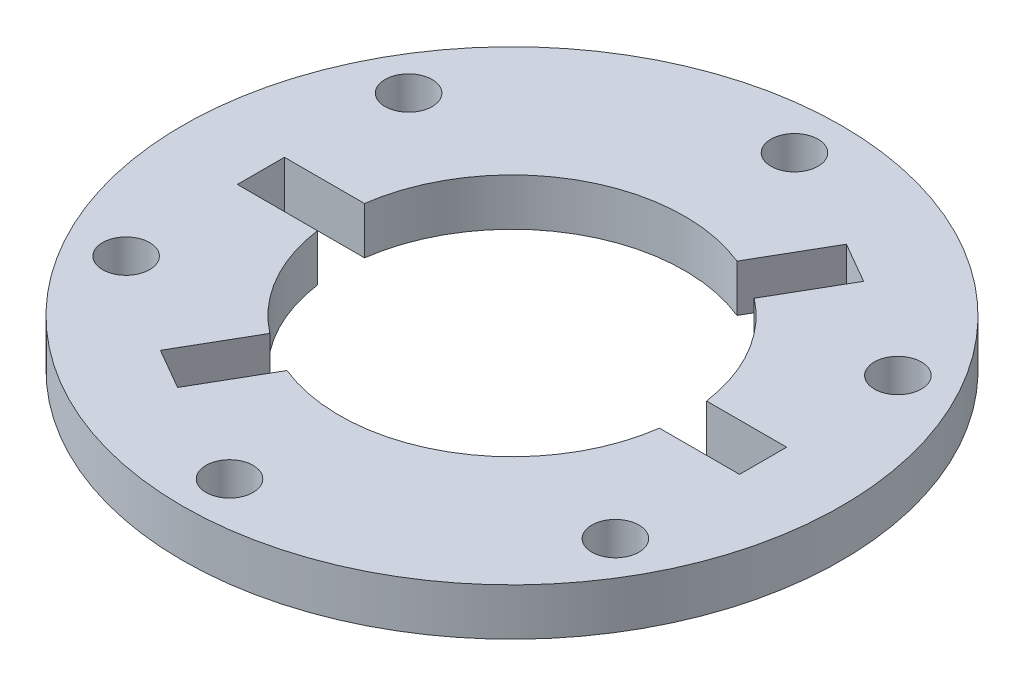
ISO-10303-21;
HEADER;
FILE_DESCRIPTION(('STEP AP214'),'2;1');
FILE_NAME('part.step','',(''),(''),'','','');
FILE_SCHEMA(('AUTOMOTIVE_DESIGN { 1 0 10303 214 1 1 1 1 }'));
ENDSEC;
DATA;
#1=APPLICATION_CONTEXT('core data for automotive mechanical design processes');
#2=APPLICATION_PROTOCOL_DEFINITION('international standard','automotive_design',2000,#1);
#3=PRODUCT_CONTEXT('',#1,'mechanical');
#4=PRODUCT('Part','Part','',(#3));
#5=PRODUCT_RELATED_PRODUCT_CATEGORY('part','',(#4));
#6=PRODUCT_DEFINITION_FORMATION('','',#4);
#7=PRODUCT_DEFINITION_CONTEXT('part definition',#1,'design');
#8=PRODUCT_DEFINITION('design','',#6,#7);
#9=PRODUCT_DEFINITION_SHAPE('','',#8);
#10=(LENGTH_UNIT() NAMED_UNIT(*) SI_UNIT(.MILLI.,.METRE.));
#11=(NAMED_UNIT(*) PLANE_ANGLE_UNIT() SI_UNIT($,.RADIAN.));
#12=(NAMED_UNIT(*) SI_UNIT($,.STERADIAN.) SOLID_ANGLE_UNIT());
#13=UNCERTAINTY_MEASURE_WITH_UNIT(LENGTH_MEASURE(1.E-05),#10,'distance_accuracy_value','');
#14=(GEOMETRIC_REPRESENTATION_CONTEXT(3) GLOBAL_UNCERTAINTY_ASSIGNED_CONTEXT((#13)) GLOBAL_UNIT_ASSIGNED_CONTEXT((#10,
#11,#12)) REPRESENTATION_CONTEXT('',''));
#15=CARTESIAN_POINT('',(0.,0.,0.));
#16=DIRECTION('',(0.,0.,1.));
#17=DIRECTION('',(1.,0.,0.));
#18=AXIS2_PLACEMENT_3D('',#15,#16,#17);
#19=CARTESIAN_POINT('',(0.,3.,0.));
#20=DIRECTION('',(0.,-1.,0.));
#21=DIRECTION('',(0.,0.,-1.));
#22=AXIS2_PLACEMENT_3D('',#19,#20,#21);
#23=CYLINDRICAL_SURFACE('',#22,11.);
#24=CARTESIAN_POINT('',(0.,0.,0.));
#25=DIRECTION('',(0.,1.,0.));
#26=DIRECTION('',(0.,0.,1.));
#27=AXIS2_PLACEMENT_3D('',#24,#25,#26);
#28=CIRCLE('',#27,11.);
#29=CARTESIAN_POINT('',(4.14958557374916,0.,-10.1872930440884));
#30=VERTEX_POINT('',#29);
#31=CARTESIAN_POINT('',(-10.8972473588517,0.,-1.5));
#32=VERTEX_POINT('',#31);
#33=EDGE_CURVE('E198',#30,#32,#28,.T.);
#34=ORIENTED_EDGE('',*,*,#33,.F.);
#35=DIRECTION('',(0.,-1.,0.));
#36=VECTOR('',#35,1.);
#37=CARTESIAN_POINT('',(4.14958557374916,3.,-10.1872930440884));
#38=LINE('',#37,#36);
#39=CARTESIAN_POINT('',(4.14958557374916,3.,-10.1872930440884));
#40=VERTEX_POINT('',#39);
#41=EDGE_CURVE('E11',#40,#30,#38,.T.);
#42=ORIENTED_EDGE('',*,*,#41,.F.);
#43=CARTESIAN_POINT('',(0.,3.,0.));
#44=DIRECTION('',(0.,1.,0.));
#45=DIRECTION('',(0.,0.,1.));
#46=AXIS2_PLACEMENT_3D('',#43,#44,#45);
#47=CIRCLE('',#46,11.);
#48=CARTESIAN_POINT('',(-10.8972473588517,3.,-1.5));
#49=VERTEX_POINT('',#48);
#50=EDGE_CURVE('E260',#40,#49,#47,.T.);
#51=ORIENTED_EDGE('',*,*,#50,.T.);
#52=DIRECTION('',(0.,-1.,0.));
#53=VECTOR('',#52,1.);
#54=CARTESIAN_POINT('',(-10.8972473588517,3.,-1.5));
#55=LINE('',#54,#53);
#56=EDGE_CURVE('E50',#49,#32,#55,.T.);
#57=ORIENTED_EDGE('',*,*,#56,.T.);
#58=EDGE_LOOP('',(#34,#42,#51,#57));
#59=FACE_BOUND('',#58,.T.);
#60=ADVANCED_FACE('F34',(#59),#23,.F.);
#61=CARTESIAN_POINT('',(-1.29903810567666,3.,-0.749999999999995));
#62=DIRECTION('',(-0.86602540378444,0.,-0.499999999999998));
#63=DIRECTION('',(-0.499999999999998,0.,0.86602540378444));
#64=AXIS2_PLACEMENT_3D('',#61,#62,#63);
#65=PLANE('',#64);
#66=DIRECTION('',(0.499999999999998,0.,-0.86602540378444));
#67=VECTOR('',#66,1.);
#68=CARTESIAN_POINT('',(-1.29903810567666,0.,-0.749999999999995));
#69=LINE('',#68,#67);
#70=CARTESIAN_POINT('',(6.7009618943233,0.,-14.606406460551));
#71=VERTEX_POINT('',#70);
#72=EDGE_CURVE('E200',#30,#71,#69,.T.);
#73=ORIENTED_EDGE('',*,*,#72,.T.);
#74=DIRECTION('',(0.,-1.,0.));
#75=VECTOR('',#74,1.);
#76=CARTESIAN_POINT('',(6.7009618943233,3.,-14.606406460551));
#77=LINE('',#76,#75);
#78=CARTESIAN_POINT('',(6.7009618943233,3.,-14.606406460551));
#79=VERTEX_POINT('',#78);
#80=EDGE_CURVE('E42',#79,#71,#77,.T.);
#81=ORIENTED_EDGE('',*,*,#80,.F.);
#82=DIRECTION('',(0.499999999999998,0.,-0.86602540378444));
#83=VECTOR('',#82,1.);
#84=CARTESIAN_POINT('',(-1.29903810567666,3.,-0.749999999999995));
#85=LINE('',#84,#83);
#86=EDGE_CURVE('E312',#40,#79,#85,.T.);
#87=ORIENTED_EDGE('',*,*,#86,.F.);
#88=ORIENTED_EDGE('',*,*,#41,.T.);
#89=EDGE_LOOP('',(#73,#81,#87,#88));
#90=FACE_BOUND('',#89,.T.);
#91=ADVANCED_FACE('F351',(#90),#65,.F.);
#92=CARTESIAN_POINT('',(7.99999999999998,3.,-13.856406460551));
#93=DIRECTION('',(0.499999999999999,0.,-0.866025403784439));
#94=DIRECTION('',(-0.866025403784439,0.,-0.499999999999999));
#95=AXIS2_PLACEMENT_3D('',#92,#93,#94);
#96=PLANE('',#95);
#97=DIRECTION('',(0.866025403784439,0.,0.499999999999999));
#98=VECTOR('',#97,1.);
#99=CARTESIAN_POINT('',(7.99999999999998,0.,-13.856406460551));
#100=LINE('',#99,#98);
#101=CARTESIAN_POINT('',(9.29903810567662,0.,-13.106406460551));
#102=VERTEX_POINT('',#101);
#103=EDGE_CURVE('E202',#71,#102,#100,.T.);
#104=ORIENTED_EDGE('',*,*,#103,.T.);
#105=DIRECTION('',(0.,-1.,0.));
#106=VECTOR('',#105,1.);
#107=CARTESIAN_POINT('',(9.29903810567662,3.,-13.106406460551));
#108=LINE('',#107,#106);
#109=CARTESIAN_POINT('',(9.29903810567662,3.,-13.106406460551));
#110=VERTEX_POINT('',#109);
#111=EDGE_CURVE('E284',#110,#102,#108,.T.);
#112=ORIENTED_EDGE('',*,*,#111,.F.);
#113=DIRECTION('',(0.866025403784439,0.,0.499999999999999));
#114=VECTOR('',#113,1.);
#115=CARTESIAN_POINT('',(7.99999999999998,3.,-13.856406460551));
#116=LINE('',#115,#114);
#117=EDGE_CURVE('E292',#79,#110,#116,.T.);
#118=ORIENTED_EDGE('',*,*,#117,.F.);
#119=ORIENTED_EDGE('',*,*,#80,.T.);
#120=EDGE_LOOP('',(#104,#112,#118,#119));
#121=FACE_BOUND('',#120,.T.);
#122=ADVANCED_FACE('F290',(#121),#96,.F.);
#123=CARTESIAN_POINT('',(1.29903810567666,3.,0.749999999999997));
#124=DIRECTION('',(-0.86602540378444,0.,-0.499999999999997));
#125=DIRECTION('',(-0.499999999999998,0.,0.86602540378444));
#126=AXIS2_PLACEMENT_3D('',#123,#124,#125);
#127=PLANE('',#126);
#128=DIRECTION('',(0.499999999999997,0.,-0.86602540378444));
#129=VECTOR('',#128,1.);
#130=CARTESIAN_POINT('',(1.29903810567666,0.,0.749999999999997));
#131=LINE('',#130,#129);
#132=CARTESIAN_POINT('',(6.74766178510247,0.,-8.68729304408845));
#133=VERTEX_POINT('',#132);
#134=EDGE_CURVE('E205',#133,#102,#131,.T.);
#135=ORIENTED_EDGE('',*,*,#134,.F.);
#136=DIRECTION('',(0.,-1.,0.));
#137=VECTOR('',#136,1.);
#138=CARTESIAN_POINT('',(6.74766178510247,3.,-8.68729304408845));
#139=LINE('',#138,#137);
#140=CARTESIAN_POINT('',(6.74766178510247,3.,-8.68729304408845));
#141=VERTEX_POINT('',#140);
#142=EDGE_CURVE('E282',#141,#133,#139,.T.);
#143=ORIENTED_EDGE('',*,*,#142,.F.);
#144=DIRECTION('',(0.499999999999997,0.,-0.86602540378444));
#145=VECTOR('',#144,1.);
#146=CARTESIAN_POINT('',(1.29903810567666,3.,0.749999999999997));
#147=LINE('',#146,#145);
#148=EDGE_CURVE('E305',#141,#110,#147,.T.);
#149=ORIENTED_EDGE('',*,*,#148,.T.);
#150=ORIENTED_EDGE('',*,*,#111,.T.);
#151=EDGE_LOOP('',(#135,#143,#149,#150));
#152=FACE_BOUND('',#151,.T.);
#153=ADVANCED_FACE('F302',(#152),#127,.T.);
#154=CARTESIAN_POINT('',(0.,3.,0.));
#155=DIRECTION('',(0.,-1.,0.));
#156=DIRECTION('',(0.,0.,-1.));
#157=AXIS2_PLACEMENT_3D('',#154,#155,#156);
#158=CYLINDRICAL_SURFACE('',#157,11.);
#159=CARTESIAN_POINT('',(0.,0.,0.));
#160=DIRECTION('',(0.,1.,0.));
#161=DIRECTION('',(0.,0.,1.));
#162=AXIS2_PLACEMENT_3D('',#159,#160,#161);
#163=CIRCLE('',#162,11.);
#164=CARTESIAN_POINT('',(10.8972473588517,0.,-1.5));
#165=VERTEX_POINT('',#164);
#166=EDGE_CURVE('E208',#165,#133,#163,.T.);
#167=ORIENTED_EDGE('',*,*,#166,.F.);
#168=DIRECTION('',(0.,-1.,0.));
#169=VECTOR('',#168,1.);
#170=CARTESIAN_POINT('',(10.8972473588517,3.,-1.5));
#171=LINE('',#170,#169);
#172=CARTESIAN_POINT('',(10.8972473588517,3.,-1.5));
#173=VERTEX_POINT('',#172);
#174=EDGE_CURVE('E280',#173,#165,#171,.T.);
#175=ORIENTED_EDGE('',*,*,#174,.F.);
#176=CARTESIAN_POINT('',(0.,3.,0.));
#177=DIRECTION('',(0.,1.,0.));
#178=DIRECTION('',(0.,0.,1.));
#179=AXIS2_PLACEMENT_3D('',#176,#177,#178);
#180=CIRCLE('',#179,11.);
#181=EDGE_CURVE('E308',#173,#141,#180,.T.);
#182=ORIENTED_EDGE('',*,*,#181,.T.);
#183=ORIENTED_EDGE('',*,*,#142,.T.);
#184=EDGE_LOOP('',(#167,#175,#182,#183));
#185=FACE_BOUND('',#184,.T.);
#186=ADVANCED_FACE('F362',(#185),#158,.F.);
#187=CARTESIAN_POINT('',(0.,3.,-1.5));
#188=DIRECTION('',(0.,0.,-1.));
#189=DIRECTION('',(-1.,0.,0.));
#190=AXIS2_PLACEMENT_3D('',#187,#188,#189);
#191=PLANE('',#190);
#192=DIRECTION('',(1.,0.,0.));
#193=VECTOR('',#192,1.);
#194=CARTESIAN_POINT('',(0.,0.,-1.5));
#195=LINE('',#194,#193);
#196=CARTESIAN_POINT('',(16.,0.,-1.5));
#197=VERTEX_POINT('',#196);
#198=EDGE_CURVE('E211',#165,#197,#195,.T.);
#199=ORIENTED_EDGE('',*,*,#198,.T.);
#200=DIRECTION('',(0.,-1.,0.));
#201=VECTOR('',#200,1.);
#202=CARTESIAN_POINT('',(16.,3.,-1.5));
#203=LINE('',#202,#201);
#204=CARTESIAN_POINT('',(16.,3.,-1.5));
#205=VERTEX_POINT('',#204);
#206=EDGE_CURVE('E277',#205,#197,#203,.T.);
#207=ORIENTED_EDGE('',*,*,#206,.F.);
#208=DIRECTION('',(1.,0.,0.));
#209=VECTOR('',#208,1.);
#210=CARTESIAN_POINT('',(0.,3.,-1.5));
#211=LINE('',#210,#209);
#212=EDGE_CURVE('E310',#173,#205,#211,.T.);
#213=ORIENTED_EDGE('',*,*,#212,.F.);
#214=ORIENTED_EDGE('',*,*,#174,.T.);
#215=EDGE_LOOP('',(#199,#207,#213,#214));
#216=FACE_BOUND('',#215,.T.);
#217=ADVANCED_FACE('F365',(#216),#191,.F.);
#218=CARTESIAN_POINT('',(16.,3.,0.));
#219=DIRECTION('',(1.,0.,0.));
#220=DIRECTION('',(0.,0.,-1.));
#221=AXIS2_PLACEMENT_3D('',#218,#219,#220);
#222=PLANE('',#221);
#223=DIRECTION('',(0.,0.,1.));
#224=VECTOR('',#223,1.);
#225=CARTESIAN_POINT('',(16.,0.,0.));
#226=LINE('',#225,#224);
#227=CARTESIAN_POINT('',(16.,0.,1.5));
#228=VERTEX_POINT('',#227);
#229=EDGE_CURVE('E213',#197,#228,#226,.T.);
#230=ORIENTED_EDGE('',*,*,#229,.T.);
#231=DIRECTION('',(0.,-1.,0.));
#232=VECTOR('',#231,1.);
#233=CARTESIAN_POINT('',(16.,3.,1.5));
#234=LINE('',#233,#232);
#235=CARTESIAN_POINT('',(16.,3.,1.5));
#236=VERTEX_POINT('',#235);
#237=EDGE_CURVE('E275',#236,#228,#234,.T.);
#238=ORIENTED_EDGE('',*,*,#237,.F.);
#239=DIRECTION('',(0.,0.,1.));
#240=VECTOR('',#239,1.);
#241=CARTESIAN_POINT('',(16.,3.,0.));
#242=LINE('',#241,#240);
#243=EDGE_CURVE('E317',#205,#236,#242,.T.);
#244=ORIENTED_EDGE('',*,*,#243,.F.);
#245=ORIENTED_EDGE('',*,*,#206,.T.);
#246=EDGE_LOOP('',(#230,#238,#244,#245));
#247=FACE_BOUND('',#246,.T.);
#248=ADVANCED_FACE('F369',(#247),#222,.F.);
#249=CARTESIAN_POINT('',(0.,3.,1.5));
#250=DIRECTION('',(0.,0.,-1.));
#251=DIRECTION('',(-1.,0.,0.));
#252=AXIS2_PLACEMENT_3D('',#249,#250,#251);
#253=PLANE('',#252);
#254=DIRECTION('',(1.,0.,0.));
#255=VECTOR('',#254,1.);
#256=CARTESIAN_POINT('',(0.,0.,1.5));
#257=LINE('',#256,#255);
#258=CARTESIAN_POINT('',(10.8972473588517,0.,1.5));
#259=VERTEX_POINT('',#258);
#260=EDGE_CURVE('E216',#259,#228,#257,.T.);
#261=ORIENTED_EDGE('',*,*,#260,.F.);
#262=DIRECTION('',(0.,-1.,0.));
#263=VECTOR('',#262,1.);
#264=CARTESIAN_POINT('',(10.8972473588517,3.,1.5));
#265=LINE('',#264,#263);
#266=CARTESIAN_POINT('',(10.8972473588517,3.,1.5));
#267=VERTEX_POINT('',#266);
#268=EDGE_CURVE('E273',#267,#259,#265,.T.);
#269=ORIENTED_EDGE('',*,*,#268,.F.);
#270=DIRECTION('',(1.,0.,0.));
#271=VECTOR('',#270,1.);
#272=CARTESIAN_POINT('',(0.,3.,1.5));
#273=LINE('',#272,#271);
#274=EDGE_CURVE('E319',#267,#236,#273,.T.);
#275=ORIENTED_EDGE('',*,*,#274,.T.);
#276=ORIENTED_EDGE('',*,*,#237,.T.);
#277=EDGE_LOOP('',(#261,#269,#275,#276));
#278=FACE_BOUND('',#277,.T.);
#279=ADVANCED_FACE('F373',(#278),#253,.T.);
#280=CARTESIAN_POINT('',(0.,3.,0.));
#281=DIRECTION('',(0.,-1.,0.));
#282=DIRECTION('',(0.,0.,-1.));
#283=AXIS2_PLACEMENT_3D('',#280,#281,#282);
#284=CYLINDRICAL_SURFACE('',#283,11.);
#285=CARTESIAN_POINT('',(0.,0.,0.));
#286=DIRECTION('',(0.,1.,0.));
#287=DIRECTION('',(0.,0.,1.));
#288=AXIS2_PLACEMENT_3D('',#285,#286,#287);
#289=CIRCLE('',#288,11.);
#290=CARTESIAN_POINT('',(-4.14958557374916,0.,10.1872930440884));
#291=VERTEX_POINT('',#290);
#292=EDGE_CURVE('E219',#291,#259,#289,.T.);
#293=ORIENTED_EDGE('',*,*,#292,.F.);
#294=DIRECTION('',(0.,-1.,0.));
#295=VECTOR('',#294,1.);
#296=CARTESIAN_POINT('',(-4.14958557374916,3.,10.1872930440884));
#297=LINE('',#296,#295);
#298=CARTESIAN_POINT('',(-4.14958557374916,3.,10.1872930440884));
#299=VERTEX_POINT('',#298);
#300=EDGE_CURVE('E271',#299,#291,#297,.T.);
#301=ORIENTED_EDGE('',*,*,#300,.F.);
#302=CARTESIAN_POINT('',(0.,3.,0.));
#303=DIRECTION('',(0.,1.,0.));
#304=DIRECTION('',(0.,0.,1.));
#305=AXIS2_PLACEMENT_3D('',#302,#303,#304);
#306=CIRCLE('',#305,11.);
#307=EDGE_CURVE('E322',#299,#267,#306,.T.);
#308=ORIENTED_EDGE('',*,*,#307,.T.);
#309=ORIENTED_EDGE('',*,*,#268,.T.);
#310=EDGE_LOOP('',(#293,#301,#308,#309));
#311=FACE_BOUND('',#310,.T.);
#312=ADVANCED_FACE('F377',(#311),#284,.F.);
#313=CARTESIAN_POINT('',(1.29903810567666,3.,0.749999999999996));
#314=DIRECTION('',(0.86602540378444,0.,0.499999999999998));
#315=DIRECTION('',(0.499999999999998,0.,-0.86602540378444));
#316=AXIS2_PLACEMENT_3D('',#313,#314,#315);
#317=PLANE('',#316);
#318=DIRECTION('',(-0.499999999999998,0.,0.86602540378444));
#319=VECTOR('',#318,1.);
#320=CARTESIAN_POINT('',(1.29903810567666,0.,0.749999999999996));
#321=LINE('',#320,#319);
#322=CARTESIAN_POINT('',(-6.7009618943233,0.,14.606406460551));
#323=VERTEX_POINT('',#322);
#324=EDGE_CURVE('E222',#291,#323,#321,.T.);
#325=ORIENTED_EDGE('',*,*,#324,.T.);
#326=DIRECTION('',(0.,-1.,0.));
#327=VECTOR('',#326,1.);
#328=CARTESIAN_POINT('',(-6.7009618943233,3.,14.606406460551));
#329=LINE('',#328,#327);
#330=CARTESIAN_POINT('',(-6.7009618943233,3.,14.606406460551));
#331=VERTEX_POINT('',#330);
#332=EDGE_CURVE('E268',#331,#323,#329,.T.);
#333=ORIENTED_EDGE('',*,*,#332,.F.);
#334=DIRECTION('',(-0.499999999999998,0.,0.86602540378444));
#335=VECTOR('',#334,1.);
#336=CARTESIAN_POINT('',(1.29903810567666,3.,0.749999999999996));
#337=LINE('',#336,#335);
#338=EDGE_CURVE('E325',#299,#331,#337,.T.);
#339=ORIENTED_EDGE('',*,*,#338,.F.);
#340=ORIENTED_EDGE('',*,*,#300,.T.);
#341=EDGE_LOOP('',(#325,#333,#339,#340));
#342=FACE_BOUND('',#341,.T.);
#343=ADVANCED_FACE('F381',(#342),#317,.F.);
#344=CARTESIAN_POINT('',(-7.99999999999995,3.,13.856406460551));
#345=DIRECTION('',(-0.499999999999997,0.,0.86602540378444));
#346=DIRECTION('',(0.86602540378444,0.,0.499999999999997));
#347=AXIS2_PLACEMENT_3D('',#344,#345,#346);
#348=PLANE('',#347);
#349=DIRECTION('',(-0.86602540378444,0.,-0.499999999999997));
#350=VECTOR('',#349,1.);
#351=CARTESIAN_POINT('',(-7.99999999999995,0.,13.856406460551));
#352=LINE('',#351,#350);
#353=CARTESIAN_POINT('',(-9.29903810567662,0.,13.106406460551));
#354=VERTEX_POINT('',#353);
#355=EDGE_CURVE('E224',#323,#354,#352,.T.);
#356=ORIENTED_EDGE('',*,*,#355,.T.);
#357=DIRECTION('',(0.,-1.,0.));
#358=VECTOR('',#357,1.);
#359=CARTESIAN_POINT('',(-9.29903810567662,3.,13.106406460551));
#360=LINE('',#359,#358);
#361=CARTESIAN_POINT('',(-9.29903810567662,3.,13.106406460551));
#362=VERTEX_POINT('',#361);
#363=EDGE_CURVE('E266',#362,#354,#360,.T.);
#364=ORIENTED_EDGE('',*,*,#363,.F.);
#365=DIRECTION('',(-0.86602540378444,0.,-0.499999999999997));
#366=VECTOR('',#365,1.);
#367=CARTESIAN_POINT('',(-7.99999999999995,3.,13.856406460551));
#368=LINE('',#367,#366);
#369=EDGE_CURVE('E327',#331,#362,#368,.T.);
#370=ORIENTED_EDGE('',*,*,#369,.F.);
#371=ORIENTED_EDGE('',*,*,#332,.T.);
#372=EDGE_LOOP('',(#356,#364,#370,#371));
#373=FACE_BOUND('',#372,.T.);
#374=ADVANCED_FACE('F385',(#373),#348,.F.);
#375=CARTESIAN_POINT('',(-1.29903810567666,3.,-0.749999999999996));
#376=DIRECTION('',(0.86602540378444,0.,0.499999999999998));
#377=DIRECTION('',(0.499999999999998,0.,-0.86602540378444));
#378=AXIS2_PLACEMENT_3D('',#375,#376,#377);
#379=PLANE('',#378);
#380=DIRECTION('',(-0.499999999999998,0.,0.86602540378444));
#381=VECTOR('',#380,1.);
#382=CARTESIAN_POINT('',(-1.29903810567666,0.,-0.749999999999996));
#383=LINE('',#382,#381);
#384=CARTESIAN_POINT('',(-6.74766178510248,0.,8.68729304408845));
#385=VERTEX_POINT('',#384);
#386=EDGE_CURVE('E227',#385,#354,#383,.T.);
#387=ORIENTED_EDGE('',*,*,#386,.F.);
#388=DIRECTION('',(0.,-1.,0.));
#389=VECTOR('',#388,1.);
#390=CARTESIAN_POINT('',(-6.74766178510248,3.,8.68729304408845));
#391=LINE('',#390,#389);
#392=CARTESIAN_POINT('',(-6.74766178510248,3.,8.68729304408845));
#393=VERTEX_POINT('',#392);
#394=EDGE_CURVE('E264',#393,#385,#391,.T.);
#395=ORIENTED_EDGE('',*,*,#394,.F.);
#396=DIRECTION('',(-0.499999999999998,0.,0.86602540378444));
#397=VECTOR('',#396,1.);
#398=CARTESIAN_POINT('',(-1.29903810567666,3.,-0.749999999999996));
#399=LINE('',#398,#397);
#400=EDGE_CURVE('E329',#393,#362,#399,.T.);
#401=ORIENTED_EDGE('',*,*,#400,.T.);
#402=ORIENTED_EDGE('',*,*,#363,.T.);
#403=EDGE_LOOP('',(#387,#395,#401,#402));
#404=FACE_BOUND('',#403,.T.);
#405=ADVANCED_FACE('F389',(#404),#379,.T.);
#406=CARTESIAN_POINT('',(0.,3.,0.));
#407=DIRECTION('',(0.,-1.,0.));
#408=DIRECTION('',(0.,0.,-1.));
#409=AXIS2_PLACEMENT_3D('',#406,#407,#408);
#410=CYLINDRICAL_SURFACE('',#409,11.);
#411=CARTESIAN_POINT('',(0.,0.,0.));
#412=DIRECTION('',(0.,1.,0.));
#413=DIRECTION('',(0.,0.,1.));
#414=AXIS2_PLACEMENT_3D('',#411,#412,#413);
#415=CIRCLE('',#414,11.);
#416=CARTESIAN_POINT('',(-10.8972473588517,0.,1.5));
#417=VERTEX_POINT('',#416);
#418=EDGE_CURVE('E230',#417,#385,#415,.T.);
#419=ORIENTED_EDGE('',*,*,#418,.F.);
#420=DIRECTION('',(0.,-1.,0.));
#421=VECTOR('',#420,1.);
#422=CARTESIAN_POINT('',(-10.8972473588517,3.,1.5));
#423=LINE('',#422,#421);
#424=CARTESIAN_POINT('',(-10.8972473588517,3.,1.5));
#425=VERTEX_POINT('',#424);
#426=EDGE_CURVE('E169',#425,#417,#423,.T.);
#427=ORIENTED_EDGE('',*,*,#426,.F.);
#428=CARTESIAN_POINT('',(0.,3.,0.));
#429=DIRECTION('',(0.,1.,0.));
#430=DIRECTION('',(0.,0.,1.));
#431=AXIS2_PLACEMENT_3D('',#428,#429,#430);
#432=CIRCLE('',#431,11.);
#433=EDGE_CURVE('E159',#425,#393,#432,.T.);
#434=ORIENTED_EDGE('',*,*,#433,.T.);
#435=ORIENTED_EDGE('',*,*,#394,.T.);
#436=EDGE_LOOP('',(#419,#427,#434,#435));
#437=FACE_BOUND('',#436,.T.);
#438=ADVANCED_FACE('F333',(#437),#410,.F.);
#439=CARTESIAN_POINT('',(0.,3.,1.5));
#440=DIRECTION('',(0.,0.,1.));
#441=DIRECTION('',(1.,0.,0.));
#442=AXIS2_PLACEMENT_3D('',#439,#440,#441);
#443=PLANE('',#442);
#444=DIRECTION('',(-1.,0.,0.));
#445=VECTOR('',#444,1.);
#446=CARTESIAN_POINT('',(0.,0.,1.5));
#447=LINE('',#446,#445);
#448=CARTESIAN_POINT('',(-16.,0.,1.5));
#449=VERTEX_POINT('',#448);
#450=EDGE_CURVE('E166',#417,#449,#447,.T.);
#451=ORIENTED_EDGE('',*,*,#450,.T.);
#452=DIRECTION('',(0.,-1.,0.));
#453=VECTOR('',#452,1.);
#454=CARTESIAN_POINT('',(-16.,3.,1.5));
#455=LINE('',#454,#453);
#456=CARTESIAN_POINT('',(-16.,3.,1.5));
#457=VERTEX_POINT('',#456);
#458=EDGE_CURVE('E163',#457,#449,#455,.T.);
#459=ORIENTED_EDGE('',*,*,#458,.F.);
#460=DIRECTION('',(-1.,0.,0.));
#461=VECTOR('',#460,1.);
#462=CARTESIAN_POINT('',(0.,3.,1.5));
#463=LINE('',#462,#461);
#464=EDGE_CURVE('E149',#425,#457,#463,.T.);
#465=ORIENTED_EDGE('',*,*,#464,.F.);
#466=ORIENTED_EDGE('',*,*,#426,.T.);
#467=EDGE_LOOP('',(#451,#459,#465,#466));
#468=FACE_BOUND('',#467,.T.);
#469=ADVANCED_FACE('F164',(#468),#443,.F.);
#470=CARTESIAN_POINT('',(-16.,3.,0.));
#471=DIRECTION('',(-1.,0.,0.));
#472=DIRECTION('',(0.,0.,1.));
#473=AXIS2_PLACEMENT_3D('',#470,#471,#472);
#474=PLANE('',#473);
#475=DIRECTION('',(0.,0.,-1.));
#476=VECTOR('',#475,1.);
#477=CARTESIAN_POINT('',(-16.,0.,0.));
#478=LINE('',#477,#476);
#479=CARTESIAN_POINT('',(-16.,0.,-1.5));
#480=VERTEX_POINT('',#479);
#481=EDGE_CURVE('E234',#449,#480,#478,.T.);
#482=ORIENTED_EDGE('',*,*,#481,.T.);
#483=DIRECTION('',(0.,-1.,0.));
#484=VECTOR('',#483,1.);
#485=CARTESIAN_POINT('',(-16.,3.,-1.5));
#486=LINE('',#485,#484);
#487=CARTESIAN_POINT('',(-16.,3.,-1.5));
#488=VERTEX_POINT('',#487);
#489=EDGE_CURVE('E100',#488,#480,#486,.T.);
#490=ORIENTED_EDGE('',*,*,#489,.F.);
#491=DIRECTION('',(0.,0.,-1.));
#492=VECTOR('',#491,1.);
#493=CARTESIAN_POINT('',(-16.,3.,0.));
#494=LINE('',#493,#492);
#495=EDGE_CURVE('E156',#457,#488,#494,.T.);
#496=ORIENTED_EDGE('',*,*,#495,.F.);
#497=ORIENTED_EDGE('',*,*,#458,.T.);
#498=EDGE_LOOP('',(#482,#490,#496,#497));
#499=FACE_BOUND('',#498,.T.);
#500=ADVANCED_FACE('F171',(#499),#474,.F.);
#501=CARTESIAN_POINT('',(0.,3.,-18.));
#502=DIRECTION('',(0.,-1.,0.));
#503=DIRECTION('',(0.,0.,-1.));
#504=AXIS2_PLACEMENT_3D('',#501,#502,#503);
#505=CYLINDRICAL_SURFACE('',#504,1.5);
#506=CARTESIAN_POINT('',(0.,3.,-18.));
#507=DIRECTION('',(0.,1.,0.));
#508=DIRECTION('',(0.,0.,1.));
#509=AXIS2_PLACEMENT_3D('',#506,#507,#508);
#510=CIRCLE('',#509,1.5);
#511=CARTESIAN_POINT('',(0.,3.,-16.5));
#512=VERTEX_POINT('',#511);
#513=EDGE_CURVE('E192',#512,#512,#510,.T.);
#514=ORIENTED_EDGE('',*,*,#513,.T.);
#515=EDGE_LOOP('',(#514));
#516=FACE_BOUND('',#515,.T.);
#517=CARTESIAN_POINT('',(0.,0.,-18.));
#518=DIRECTION('',(0.,1.,0.));
#519=DIRECTION('',(0.,0.,1.));
#520=AXIS2_PLACEMENT_3D('',#517,#518,#519);
#521=CIRCLE('',#520,1.5);
#522=CARTESIAN_POINT('',(0.,0.,-16.5));
#523=VERTEX_POINT('',#522);
#524=EDGE_CURVE('E254',#523,#523,#521,.T.);
#525=ORIENTED_EDGE('',*,*,#524,.F.);
#526=EDGE_LOOP('',(#525));
#527=FACE_BOUND('',#526,.T.);
#528=ADVANCED_FACE('F398',(#516,#527),#505,.F.);
#529=CARTESIAN_POINT('',(15.5884572681199,3.,-9.00000000000001));
#530=DIRECTION('',(0.,-1.,0.));
#531=DIRECTION('',(0.,0.,-1.));
#532=AXIS2_PLACEMENT_3D('',#529,#530,#531);
#533=CYLINDRICAL_SURFACE('',#532,1.50000000000005);
#534=CARTESIAN_POINT('',(15.5884572681199,3.,-9.00000000000001));
#535=DIRECTION('',(0.,1.,0.));
#536=DIRECTION('',(0.,0.,1.));
#537=AXIS2_PLACEMENT_3D('',#534,#535,#536);
#538=CIRCLE('',#537,1.50000000000005);
#539=CARTESIAN_POINT('',(15.5884572681199,3.,-7.49999999999995));
#540=VERTEX_POINT('',#539);
#541=EDGE_CURVE('E189',#540,#540,#538,.T.);
#542=ORIENTED_EDGE('',*,*,#541,.T.);
#543=EDGE_LOOP('',(#542));
#544=FACE_BOUND('',#543,.T.);
#545=CARTESIAN_POINT('',(15.5884572681199,0.,-9.00000000000001));
#546=DIRECTION('',(0.,1.,0.));
#547=DIRECTION('',(0.,0.,1.));
#548=AXIS2_PLACEMENT_3D('',#545,#546,#547);
#549=CIRCLE('',#548,1.50000000000005);
#550=CARTESIAN_POINT('',(15.5884572681199,0.,-7.49999999999995));
#551=VERTEX_POINT('',#550);
#552=EDGE_CURVE('E251',#551,#551,#549,.T.);
#553=ORIENTED_EDGE('',*,*,#552,.F.);
#554=EDGE_LOOP('',(#553));
#555=FACE_BOUND('',#554,.T.);
#556=ADVANCED_FACE('F402',(#544,#555),#533,.F.);
#557=CARTESIAN_POINT('',(15.5884572681199,3.,9.));
#558=DIRECTION('',(0.,-1.,0.));
#559=DIRECTION('',(0.,0.,-1.));
#560=AXIS2_PLACEMENT_3D('',#557,#558,#559);
#561=CYLINDRICAL_SURFACE('',#560,1.50000000000009);
#562=CARTESIAN_POINT('',(15.5884572681199,3.,9.));
#563=DIRECTION('',(0.,1.,0.));
#564=DIRECTION('',(0.,0.,1.));
#565=AXIS2_PLACEMENT_3D('',#562,#563,#564);
#566=CIRCLE('',#565,1.50000000000009);
#567=CARTESIAN_POINT('',(15.5884572681199,3.,10.5000000000001));
#568=VERTEX_POINT('',#567);
#569=EDGE_CURVE('E186',#568,#568,#566,.T.);
#570=ORIENTED_EDGE('',*,*,#569,.T.);
#571=EDGE_LOOP('',(#570));
#572=FACE_BOUND('',#571,.T.);
#573=CARTESIAN_POINT('',(15.5884572681199,0.,9.));
#574=DIRECTION('',(0.,1.,0.));
#575=DIRECTION('',(0.,0.,1.));
#576=AXIS2_PLACEMENT_3D('',#573,#574,#575);
#577=CIRCLE('',#576,1.50000000000009);
#578=CARTESIAN_POINT('',(15.5884572681199,0.,10.5000000000001));
#579=VERTEX_POINT('',#578);
#580=EDGE_CURVE('E248',#579,#579,#577,.T.);
#581=ORIENTED_EDGE('',*,*,#580,.F.);
#582=EDGE_LOOP('',(#581));
#583=FACE_BOUND('',#582,.T.);
#584=ADVANCED_FACE('F408',(#572,#583),#561,.F.);
#585=CARTESIAN_POINT('',(0.,3.,18.));
#586=DIRECTION('',(0.,-1.,0.));
#587=DIRECTION('',(0.,0.,-1.));
#588=AXIS2_PLACEMENT_3D('',#585,#586,#587);
#589=CYLINDRICAL_SURFACE('',#588,1.50000000000012);
#590=CARTESIAN_POINT('',(0.,3.,18.));
#591=DIRECTION('',(0.,1.,0.));
#592=DIRECTION('',(0.,0.,1.));
#593=AXIS2_PLACEMENT_3D('',#590,#591,#592);
#594=CIRCLE('',#593,1.50000000000012);
#595=CARTESIAN_POINT('',(0.,3.,19.5000000000001));
#596=VERTEX_POINT('',#595);
#597=EDGE_CURVE('E183',#596,#596,#594,.T.);
#598=ORIENTED_EDGE('',*,*,#597,.T.);
#599=EDGE_LOOP('',(#598));
#600=FACE_BOUND('',#599,.T.);
#601=CARTESIAN_POINT('',(0.,0.,18.));
#602=DIRECTION('',(0.,1.,0.));
#603=DIRECTION('',(0.,0.,1.));
#604=AXIS2_PLACEMENT_3D('',#601,#602,#603);
#605=CIRCLE('',#604,1.50000000000012);
#606=CARTESIAN_POINT('',(0.,0.,19.5000000000001));
#607=VERTEX_POINT('',#606);
#608=EDGE_CURVE('E245',#607,#607,#605,.T.);
#609=ORIENTED_EDGE('',*,*,#608,.F.);
#610=EDGE_LOOP('',(#609));
#611=FACE_BOUND('',#610,.T.);
#612=ADVANCED_FACE('F416',(#600,#611),#589,.F.);
#613=CARTESIAN_POINT('',(-15.5884572681199,3.,9.00000000000001));
#614=DIRECTION('',(0.,-1.,0.));
#615=DIRECTION('',(0.,0.,-1.));
#616=AXIS2_PLACEMENT_3D('',#613,#614,#615);
#617=CYLINDRICAL_SURFACE('',#616,1.50000000000017);
#618=CARTESIAN_POINT('',(-15.5884572681199,3.,9.00000000000001));
#619=DIRECTION('',(0.,1.,0.));
#620=DIRECTION('',(0.,0.,1.));
#621=AXIS2_PLACEMENT_3D('',#618,#619,#620);
#622=CIRCLE('',#621,1.50000000000017);
#623=CARTESIAN_POINT('',(-15.5884572681199,3.,10.5000000000002));
#624=VERTEX_POINT('',#623);
#625=EDGE_CURVE('E180',#624,#624,#622,.T.);
#626=ORIENTED_EDGE('',*,*,#625,.T.);
#627=EDGE_LOOP('',(#626));
#628=FACE_BOUND('',#627,.T.);
#629=CARTESIAN_POINT('',(-15.5884572681199,0.,9.00000000000001));
#630=DIRECTION('',(0.,1.,0.));
#631=DIRECTION('',(0.,0.,1.));
#632=AXIS2_PLACEMENT_3D('',#629,#630,#631);
#633=CIRCLE('',#632,1.50000000000017);
#634=CARTESIAN_POINT('',(-15.5884572681199,0.,10.5000000000002));
#635=VERTEX_POINT('',#634);
#636=EDGE_CURVE('E242',#635,#635,#633,.T.);
#637=ORIENTED_EDGE('',*,*,#636,.F.);
#638=EDGE_LOOP('',(#637));
#639=FACE_BOUND('',#638,.T.);
#640=ADVANCED_FACE('F346',(#628,#639),#617,.F.);
#641=CARTESIAN_POINT('',(-15.5884572681199,3.,-8.99999999999999));
#642=DIRECTION('',(0.,-1.,0.));
#643=DIRECTION('',(0.,0.,-1.));
#644=AXIS2_PLACEMENT_3D('',#641,#642,#643);
#645=CYLINDRICAL_SURFACE('',#644,1.50000000000022);
#646=CARTESIAN_POINT('',(-15.5884572681199,3.,-8.99999999999999));
#647=DIRECTION('',(0.,1.,0.));
#648=DIRECTION('',(0.,0.,1.));
#649=AXIS2_PLACEMENT_3D('',#646,#647,#648);
#650=CIRCLE('',#649,1.50000000000022);
#651=CARTESIAN_POINT('',(-15.5884572681199,3.,-7.49999999999977));
#652=VERTEX_POINT('',#651);
#653=EDGE_CURVE('E174',#652,#652,#650,.T.);
#654=ORIENTED_EDGE('',*,*,#653,.T.);
#655=EDGE_LOOP('',(#654));
#656=FACE_BOUND('',#655,.T.);
#657=CARTESIAN_POINT('',(-15.5884572681199,0.,-8.99999999999999));
#658=DIRECTION('',(0.,1.,0.));
#659=DIRECTION('',(0.,0.,1.));
#660=AXIS2_PLACEMENT_3D('',#657,#658,#659);
#661=CIRCLE('',#660,1.50000000000022);
#662=CARTESIAN_POINT('',(-15.5884572681199,0.,-7.49999999999977));
#663=VERTEX_POINT('',#662);
#664=EDGE_CURVE('E239',#663,#663,#661,.T.);
#665=ORIENTED_EDGE('',*,*,#664,.F.);
#666=EDGE_LOOP('',(#665));
#667=FACE_BOUND('',#666,.T.);
#668=ADVANCED_FACE('F338',(#656,#667),#645,.F.);
#669=CARTESIAN_POINT('',(0.,3.,-1.5));
#670=DIRECTION('',(0.,0.,1.));
#671=DIRECTION('',(1.,0.,0.));
#672=AXIS2_PLACEMENT_3D('',#669,#670,#671);
#673=PLANE('',#672);
#674=DIRECTION('',(-1.,0.,0.));
#675=VECTOR('',#674,1.);
#676=CARTESIAN_POINT('',(0.,0.,-1.5));
#677=LINE('',#676,#675);
#678=EDGE_CURVE('E236',#32,#480,#677,.T.);
#679=ORIENTED_EDGE('',*,*,#678,.F.);
#680=ORIENTED_EDGE('',*,*,#56,.F.);
#681=DIRECTION('',(-1.,0.,0.));
#682=VECTOR('',#681,1.);
#683=CARTESIAN_POINT('',(0.,3.,-1.5));
#684=LINE('',#683,#682);
#685=EDGE_CURVE('E172',#49,#488,#684,.T.);
#686=ORIENTED_EDGE('',*,*,#685,.T.);
#687=ORIENTED_EDGE('',*,*,#489,.T.);
#688=EDGE_LOOP('',(#679,#680,#686,#687));
#689=FACE_BOUND('',#688,.T.);
#690=ADVANCED_FACE('F335',(#689),#673,.T.);
#691=CARTESIAN_POINT('',(0.,3.,0.));
#692=DIRECTION('',(0.,-1.,0.));
#693=DIRECTION('',(0.,0.,-1.));
#694=AXIS2_PLACEMENT_3D('',#691,#692,#693);
#695=CYLINDRICAL_SURFACE('',#694,21.);
#696=CARTESIAN_POINT('',(0.,3.,0.));
#697=DIRECTION('',(0.,1.,0.));
#698=DIRECTION('',(0.,0.,1.));
#699=AXIS2_PLACEMENT_3D('',#696,#697,#698);
#700=CIRCLE('',#699,21.);
#701=CARTESIAN_POINT('',(0.,3.,21.));
#702=VERTEX_POINT('',#701);
#703=EDGE_CURVE('E195',#702,#702,#700,.T.);
#704=ORIENTED_EDGE('',*,*,#703,.F.);
#705=EDGE_LOOP('',(#704));
#706=FACE_BOUND('',#705,.T.);
#707=CARTESIAN_POINT('',(0.,0.,0.));
#708=DIRECTION('',(0.,1.,0.));
#709=DIRECTION('',(0.,0.,1.));
#710=AXIS2_PLACEMENT_3D('',#707,#708,#709);
#711=CIRCLE('',#710,21.);
#712=CARTESIAN_POINT('',(0.,0.,21.));
#713=VERTEX_POINT('',#712);
#714=EDGE_CURVE('E257',#713,#713,#711,.T.);
#715=ORIENTED_EDGE('',*,*,#714,.T.);
#716=EDGE_LOOP('',(#715));
#717=FACE_BOUND('',#716,.T.);
#718=ADVANCED_FACE('F337',(#706,#717),#695,.T.);
#719=CARTESIAN_POINT('',(0.,3.,0.));
#720=DIRECTION('',(0.,1.,0.));
#721=DIRECTION('',(0.,0.,1.));
#722=AXIS2_PLACEMENT_3D('',#719,#720,#721);
#723=PLANE('',#722);
#724=ORIENTED_EDGE('',*,*,#50,.F.);
#725=ORIENTED_EDGE('',*,*,#86,.T.);
#726=ORIENTED_EDGE('',*,*,#117,.T.);
#727=ORIENTED_EDGE('',*,*,#148,.F.);
#728=ORIENTED_EDGE('',*,*,#181,.F.);
#729=ORIENTED_EDGE('',*,*,#212,.T.);
#730=ORIENTED_EDGE('',*,*,#243,.T.);
#731=ORIENTED_EDGE('',*,*,#274,.F.);
#732=ORIENTED_EDGE('',*,*,#307,.F.);
#733=ORIENTED_EDGE('',*,*,#338,.T.);
#734=ORIENTED_EDGE('',*,*,#369,.T.);
#735=ORIENTED_EDGE('',*,*,#400,.F.);
#736=ORIENTED_EDGE('',*,*,#433,.F.);
#737=ORIENTED_EDGE('',*,*,#464,.T.);
#738=ORIENTED_EDGE('',*,*,#495,.T.);
#739=ORIENTED_EDGE('',*,*,#685,.F.);
#740=EDGE_LOOP('',(#724,#725,#726,#727,#728,#729,#730,#731,#732,#733,#734,#735,#736,#737,#738,#739));
#741=FACE_BOUND('',#740,.T.);
#742=ORIENTED_EDGE('',*,*,#653,.F.);
#743=EDGE_LOOP('',(#742));
#744=FACE_BOUND('',#743,.T.);
#745=ORIENTED_EDGE('',*,*,#625,.F.);
#746=EDGE_LOOP('',(#745));
#747=FACE_BOUND('',#746,.T.);
#748=ORIENTED_EDGE('',*,*,#597,.F.);
#749=EDGE_LOOP('',(#748));
#750=FACE_BOUND('',#749,.T.);
#751=ORIENTED_EDGE('',*,*,#569,.F.);
#752=EDGE_LOOP('',(#751));
#753=FACE_BOUND('',#752,.T.);
#754=ORIENTED_EDGE('',*,*,#541,.F.);
#755=EDGE_LOOP('',(#754));
#756=FACE_BOUND('',#755,.T.);
#757=ORIENTED_EDGE('',*,*,#513,.F.);
#758=EDGE_LOOP('',(#757));
#759=FACE_BOUND('',#758,.T.);
#760=ORIENTED_EDGE('',*,*,#703,.T.);
#761=EDGE_LOOP('',(#760));
#762=FACE_BOUND('',#761,.T.);
#763=ADVANCED_FACE('F152',(#741,#744,#747,#750,#753,#756,#759,#762),#723,.T.);
#764=CARTESIAN_POINT('',(0.,0.,0.));
#765=DIRECTION('',(0.,1.,0.));
#766=DIRECTION('',(0.,0.,1.));
#767=AXIS2_PLACEMENT_3D('',#764,#765,#766);
#768=PLANE('',#767);
#769=ORIENTED_EDGE('',*,*,#33,.T.);
#770=ORIENTED_EDGE('',*,*,#678,.T.);
#771=ORIENTED_EDGE('',*,*,#481,.F.);
#772=ORIENTED_EDGE('',*,*,#450,.F.);
#773=ORIENTED_EDGE('',*,*,#418,.T.);
#774=ORIENTED_EDGE('',*,*,#386,.T.);
#775=ORIENTED_EDGE('',*,*,#355,.F.);
#776=ORIENTED_EDGE('',*,*,#324,.F.);
#777=ORIENTED_EDGE('',*,*,#292,.T.);
#778=ORIENTED_EDGE('',*,*,#260,.T.);
#779=ORIENTED_EDGE('',*,*,#229,.F.);
#780=ORIENTED_EDGE('',*,*,#198,.F.);
#781=ORIENTED_EDGE('',*,*,#166,.T.);
#782=ORIENTED_EDGE('',*,*,#134,.T.);
#783=ORIENTED_EDGE('',*,*,#103,.F.);
#784=ORIENTED_EDGE('',*,*,#72,.F.);
#785=EDGE_LOOP('',(#769,#770,#771,#772,#773,#774,#775,#776,#777,#778,#779,#780,#781,#782,#783,#784));
#786=FACE_BOUND('',#785,.T.);
#787=ORIENTED_EDGE('',*,*,#664,.T.);
#788=EDGE_LOOP('',(#787));
#789=FACE_BOUND('',#788,.T.);
#790=ORIENTED_EDGE('',*,*,#636,.T.);
#791=EDGE_LOOP('',(#790));
#792=FACE_BOUND('',#791,.T.);
#793=ORIENTED_EDGE('',*,*,#608,.T.);
#794=EDGE_LOOP('',(#793));
#795=FACE_BOUND('',#794,.T.);
#796=ORIENTED_EDGE('',*,*,#580,.T.);
#797=EDGE_LOOP('',(#796));
#798=FACE_BOUND('',#797,.T.);
#799=ORIENTED_EDGE('',*,*,#552,.T.);
#800=EDGE_LOOP('',(#799));
#801=FACE_BOUND('',#800,.T.);
#802=ORIENTED_EDGE('',*,*,#524,.T.);
#803=EDGE_LOOP('',(#802));
#804=FACE_BOUND('',#803,.T.);
#805=ORIENTED_EDGE('',*,*,#714,.F.);
#806=EDGE_LOOP('',(#805));
#807=FACE_BOUND('',#806,.T.);
#808=ADVANCED_FACE('F296',(#786,#789,#792,#795,#798,#801,#804,#807),#768,.F.);
#809=CLOSED_SHELL('',(#60,#91,#122,#153,#186,#217,#248,#279,#312,#343,#374,#405,#438,#469,#500,
#528,#556,#584,#612,#640,#668,#690,#718,#763,#808));
#810=MANIFOLD_SOLID_BREP('B2',#809);
#811=ADVANCED_BREP_SHAPE_REPRESENTATION('',(#18,#810),#14);
#812=SHAPE_DEFINITION_REPRESENTATION(#9,#811);
ENDSEC;
END-ISO-10303-21;
